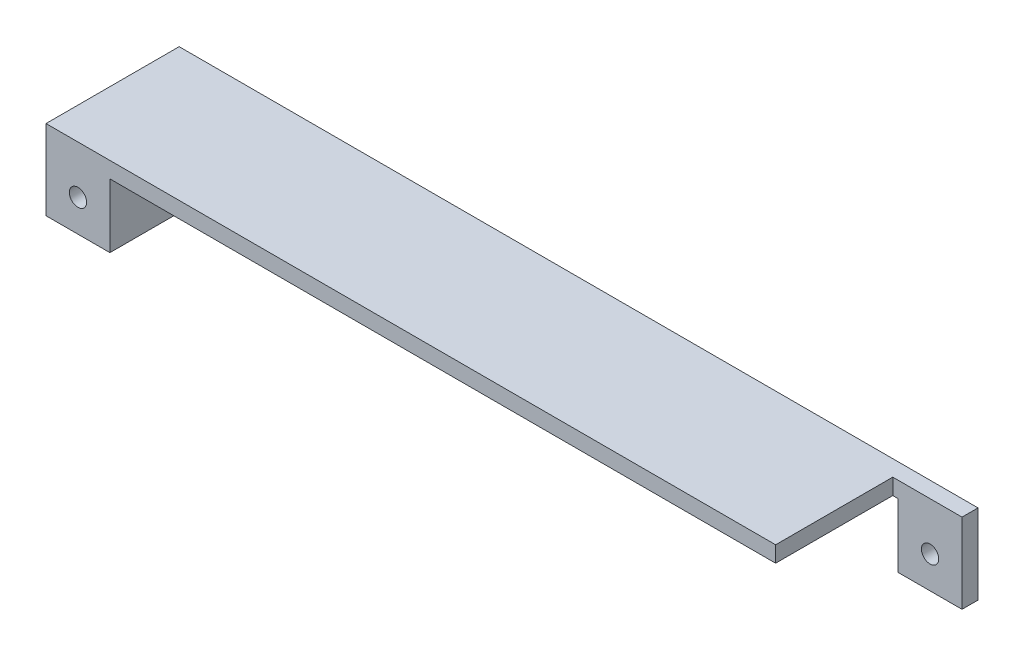
ISO-10303-21;
HEADER;
FILE_DESCRIPTION(('STEP AP214'),'2;1');
FILE_NAME('part.step','',(''),(''),'','','');
FILE_SCHEMA(('AUTOMOTIVE_DESIGN { 1 0 10303 214 1 1 1 1 }'));
ENDSEC;
DATA;
#1=APPLICATION_CONTEXT('core data for automotive mechanical design processes');
#2=APPLICATION_PROTOCOL_DEFINITION('international standard','automotive_design',2000,#1);
#3=PRODUCT_CONTEXT('',#1,'mechanical');
#4=PRODUCT('Part','Part','',(#3));
#5=PRODUCT_RELATED_PRODUCT_CATEGORY('part','',(#4));
#6=PRODUCT_DEFINITION_FORMATION('','',#4);
#7=PRODUCT_DEFINITION_CONTEXT('part definition',#1,'design');
#8=PRODUCT_DEFINITION('design','',#6,#7);
#9=PRODUCT_DEFINITION_SHAPE('','',#8);
#10=(LENGTH_UNIT() NAMED_UNIT(*) SI_UNIT(.MILLI.,.METRE.));
#11=(NAMED_UNIT(*) PLANE_ANGLE_UNIT() SI_UNIT($,.RADIAN.));
#12=(NAMED_UNIT(*) SI_UNIT($,.STERADIAN.) SOLID_ANGLE_UNIT());
#13=UNCERTAINTY_MEASURE_WITH_UNIT(LENGTH_MEASURE(1.E-05),#10,'distance_accuracy_value','');
#14=(GEOMETRIC_REPRESENTATION_CONTEXT(3) GLOBAL_UNCERTAINTY_ASSIGNED_CONTEXT((#13)) GLOBAL_UNIT_ASSIGNED_CONTEXT((#10,
#11,#12)) REPRESENTATION_CONTEXT('',''));
#15=CARTESIAN_POINT('',(0.,0.,0.));
#16=DIRECTION('',(0.,0.,1.));
#17=DIRECTION('',(1.,0.,0.));
#18=AXIS2_PLACEMENT_3D('',#15,#16,#17);
#19=CARTESIAN_POINT('',(0.,0.,0.));
#20=DIRECTION('',(0.,-1.,0.));
#21=DIRECTION('',(0.,0.,-1.));
#22=AXIS2_PLACEMENT_3D('',#19,#20,#21);
#23=PLANE('',#22);
#24=DIRECTION('',(0.,0.,-1.));
#25=VECTOR('',#24,1.);
#26=CARTESIAN_POINT('',(137.,0.,0.));
#27=LINE('',#26,#25);
#28=CARTESIAN_POINT('',(137.,0.,0.));
#29=VERTEX_POINT('',#28);
#30=CARTESIAN_POINT('',(137.,0.,-22.));
#31=VERTEX_POINT('',#30);
#32=EDGE_CURVE('E236',#29,#31,#27,.T.);
#33=ORIENTED_EDGE('',*,*,#32,.F.);
#34=DIRECTION('',(1.,0.,0.));
#35=VECTOR('',#34,1.);
#36=CARTESIAN_POINT('',(0.,0.,0.));
#37=LINE('',#36,#35);
#38=CARTESIAN_POINT('',(12.,0.,0.));
#39=VERTEX_POINT('',#38);
#40=EDGE_CURVE('E184',#39,#29,#37,.T.);
#41=ORIENTED_EDGE('',*,*,#40,.F.);
#42=DIRECTION('',(0.,0.,1.));
#43=VECTOR('',#42,1.);
#44=CARTESIAN_POINT('',(12.,0.,0.));
#45=LINE('',#44,#43);
#46=CARTESIAN_POINT('',(12.,0.,-25.));
#47=VERTEX_POINT('',#46);
#48=EDGE_CURVE('E158',#47,#39,#45,.T.);
#49=ORIENTED_EDGE('',*,*,#48,.F.);
#50=DIRECTION('',(-1.,0.,0.));
#51=VECTOR('',#50,1.);
#52=CARTESIAN_POINT('',(0.,0.,-25.));
#53=LINE('',#52,#51);
#54=CARTESIAN_POINT('',(138.,0.,-25.));
#55=VERTEX_POINT('',#54);
#56=EDGE_CURVE('E190',#55,#47,#53,.T.);
#57=ORIENTED_EDGE('',*,*,#56,.F.);
#58=DIRECTION('',(0.,0.,-1.));
#59=VECTOR('',#58,1.);
#60=CARTESIAN_POINT('',(138.,0.,0.));
#61=LINE('',#60,#59);
#62=CARTESIAN_POINT('',(138.,0.,-22.));
#63=VERTEX_POINT('',#62);
#64=EDGE_CURVE('E62',#63,#55,#61,.T.);
#65=ORIENTED_EDGE('',*,*,#64,.F.);
#66=DIRECTION('',(1.,0.,0.));
#67=VECTOR('',#66,1.);
#68=CARTESIAN_POINT('',(0.,0.,-22.));
#69=LINE('',#68,#67);
#70=EDGE_CURVE('E233',#31,#63,#69,.T.);
#71=ORIENTED_EDGE('',*,*,#70,.F.);
#72=EDGE_LOOP('',(#33,#41,#49,#57,#65,#71));
#73=FACE_BOUND('',#72,.T.);
#74=ADVANCED_FACE('F38',(#73),#23,.T.);
#75=CARTESIAN_POINT('',(0.,3.,0.));
#76=DIRECTION('',(1.,0.,0.));
#77=DIRECTION('',(0.,0.,-1.));
#78=AXIS2_PLACEMENT_3D('',#75,#76,#77);
#79=PLANE('',#78);
#80=DIRECTION('',(0.,-1.,0.));
#81=VECTOR('',#80,1.);
#82=CARTESIAN_POINT('',(0.,3.,-25.));
#83=LINE('',#82,#81);
#84=CARTESIAN_POINT('',(0.,3.,-25.));
#85=VERTEX_POINT('',#84);
#86=CARTESIAN_POINT('',(0.,-12.,-25.));
#87=VERTEX_POINT('',#86);
#88=EDGE_CURVE('E199',#85,#87,#83,.T.);
#89=ORIENTED_EDGE('',*,*,#88,.T.);
#90=DIRECTION('',(0.,0.,-1.));
#91=VECTOR('',#90,1.);
#92=CARTESIAN_POINT('',(0.,-12.,0.));
#93=LINE('',#92,#91);
#94=CARTESIAN_POINT('',(0.,-12.,0.));
#95=VERTEX_POINT('',#94);
#96=EDGE_CURVE('E159',#95,#87,#93,.T.);
#97=ORIENTED_EDGE('',*,*,#96,.F.);
#98=DIRECTION('',(0.,-1.,0.));
#99=VECTOR('',#98,1.);
#100=CARTESIAN_POINT('',(0.,3.,0.));
#101=LINE('',#100,#99);
#102=CARTESIAN_POINT('',(0.,3.,0.));
#103=VERTEX_POINT('',#102);
#104=EDGE_CURVE('E11',#103,#95,#101,.T.);
#105=ORIENTED_EDGE('',*,*,#104,.F.);
#106=DIRECTION('',(0.,0.,1.));
#107=VECTOR('',#106,1.);
#108=CARTESIAN_POINT('',(0.,3.,0.));
#109=LINE('',#108,#107);
#110=EDGE_CURVE('E185',#85,#103,#109,.T.);
#111=ORIENTED_EDGE('',*,*,#110,.F.);
#112=EDGE_LOOP('',(#89,#97,#105,#111));
#113=FACE_BOUND('',#112,.T.);
#114=ADVANCED_FACE('F40',(#113),#79,.F.);
#115=CARTESIAN_POINT('',(0.,3.,0.));
#116=DIRECTION('',(0.,0.,-1.));
#117=DIRECTION('',(-1.,0.,0.));
#118=AXIS2_PLACEMENT_3D('',#115,#116,#117);
#119=PLANE('',#118);
#120=CARTESIAN_POINT('',(6.,-6.,0.));
#121=DIRECTION('',(0.,0.,1.));
#122=DIRECTION('',(1.,0.,0.));
#123=AXIS2_PLACEMENT_3D('',#120,#121,#122);
#124=CIRCLE('',#123,1.625);
#125=CARTESIAN_POINT('',(7.625,-6.,0.));
#126=VERTEX_POINT('',#125);
#127=EDGE_CURVE('E241',#126,#126,#124,.T.);
#128=ORIENTED_EDGE('',*,*,#127,.F.);
#129=EDGE_LOOP('',(#128));
#130=FACE_BOUND('',#129,.T.);
#131=ORIENTED_EDGE('',*,*,#40,.T.);
#132=DIRECTION('',(0.,1.,0.));
#133=VECTOR('',#132,1.);
#134=CARTESIAN_POINT('',(137.,-12.,0.));
#135=LINE('',#134,#133);
#136=CARTESIAN_POINT('',(137.,3.,0.));
#137=VERTEX_POINT('',#136);
#138=EDGE_CURVE('E225',#29,#137,#135,.T.);
#139=ORIENTED_EDGE('',*,*,#138,.T.);
#140=DIRECTION('',(1.,0.,0.));
#141=VECTOR('',#140,1.);
#142=CARTESIAN_POINT('',(0.,3.,0.));
#143=LINE('',#142,#141);
#144=EDGE_CURVE('E189',#103,#137,#143,.T.);
#145=ORIENTED_EDGE('',*,*,#144,.F.);
#146=ORIENTED_EDGE('',*,*,#104,.T.);
#147=DIRECTION('',(-1.,0.,0.));
#148=VECTOR('',#147,1.);
#149=CARTESIAN_POINT('',(0.,-12.,0.));
#150=LINE('',#149,#148);
#151=CARTESIAN_POINT('',(12.,-12.,0.));
#152=VERTEX_POINT('',#151);
#153=EDGE_CURVE('E169',#152,#95,#150,.T.);
#154=ORIENTED_EDGE('',*,*,#153,.F.);
#155=DIRECTION('',(0.,1.,0.));
#156=VECTOR('',#155,1.);
#157=CARTESIAN_POINT('',(12.,-12.,0.));
#158=LINE('',#157,#156);
#159=EDGE_CURVE('E173',#152,#39,#158,.T.);
#160=ORIENTED_EDGE('',*,*,#159,.T.);
#161=EDGE_LOOP('',(#131,#139,#145,#146,#154,#160));
#162=FACE_BOUND('',#161,.T.);
#163=ADVANCED_FACE('F274',(#130,#162),#119,.F.);
#164=CARTESIAN_POINT('',(150.,3.,0.));
#165=DIRECTION('',(-1.,0.,0.));
#166=DIRECTION('',(0.,0.,1.));
#167=AXIS2_PLACEMENT_3D('',#164,#165,#166);
#168=PLANE('',#167);
#169=DIRECTION('',(0.,0.,-1.));
#170=VECTOR('',#169,1.);
#171=CARTESIAN_POINT('',(150.,3.,0.));
#172=LINE('',#171,#170);
#173=CARTESIAN_POINT('',(150.,3.,-22.));
#174=VERTEX_POINT('',#173);
#175=CARTESIAN_POINT('',(150.,3.,-25.));
#176=VERTEX_POINT('',#175);
#177=EDGE_CURVE('E133',#174,#176,#172,.T.);
#178=ORIENTED_EDGE('',*,*,#177,.F.);
#179=DIRECTION('',(0.,1.,0.));
#180=VECTOR('',#179,1.);
#181=CARTESIAN_POINT('',(150.,-12.,-22.));
#182=LINE('',#181,#180);
#183=CARTESIAN_POINT('',(150.,-12.,-22.));
#184=VERTEX_POINT('',#183);
#185=EDGE_CURVE('E119',#184,#174,#182,.T.);
#186=ORIENTED_EDGE('',*,*,#185,.F.);
#187=DIRECTION('',(0.,0.,1.));
#188=VECTOR('',#187,1.);
#189=CARTESIAN_POINT('',(150.,-12.,0.));
#190=LINE('',#189,#188);
#191=CARTESIAN_POINT('',(150.,-12.,-25.));
#192=VERTEX_POINT('',#191);
#193=EDGE_CURVE('E132',#192,#184,#190,.T.);
#194=ORIENTED_EDGE('',*,*,#193,.F.);
#195=DIRECTION('',(0.,-1.,0.));
#196=VECTOR('',#195,1.);
#197=CARTESIAN_POINT('',(150.,3.,-25.));
#198=LINE('',#197,#196);
#199=EDGE_CURVE('E48',#176,#192,#198,.T.);
#200=ORIENTED_EDGE('',*,*,#199,.F.);
#201=EDGE_LOOP('',(#178,#186,#194,#200));
#202=FACE_BOUND('',#201,.T.);
#203=ADVANCED_FACE('F130',(#202),#168,.F.);
#204=CARTESIAN_POINT('',(0.,3.,-25.));
#205=DIRECTION('',(0.,0.,1.));
#206=DIRECTION('',(1.,0.,0.));
#207=AXIS2_PLACEMENT_3D('',#204,#205,#206);
#208=PLANE('',#207);
#209=CARTESIAN_POINT('',(6.,-6.,-25.));
#210=DIRECTION('',(0.,0.,1.));
#211=DIRECTION('',(1.,0.,0.));
#212=AXIS2_PLACEMENT_3D('',#209,#210,#211);
#213=CIRCLE('',#212,1.625);
#214=CARTESIAN_POINT('',(7.625,-6.,-25.));
#215=VERTEX_POINT('',#214);
#216=EDGE_CURVE('E147',#215,#215,#213,.T.);
#217=ORIENTED_EDGE('',*,*,#216,.T.);
#218=EDGE_LOOP('',(#217));
#219=FACE_BOUND('',#218,.T.);
#220=CARTESIAN_POINT('',(144.,-5.99999999999998,-25.));
#221=DIRECTION('',(0.,0.,1.));
#222=DIRECTION('',(-1.,0.,0.));
#223=AXIS2_PLACEMENT_3D('',#220,#221,#222);
#224=CIRCLE('',#223,1.62499999999998);
#225=CARTESIAN_POINT('',(142.375,-5.99999999999998,-25.));
#226=VERTEX_POINT('',#225);
#227=EDGE_CURVE('E150',#226,#226,#224,.T.);
#228=ORIENTED_EDGE('',*,*,#227,.T.);
#229=EDGE_LOOP('',(#228));
#230=FACE_BOUND('',#229,.T.);
#231=ORIENTED_EDGE('',*,*,#199,.T.);
#232=DIRECTION('',(1.,0.,0.));
#233=VECTOR('',#232,1.);
#234=CARTESIAN_POINT('',(150.,-12.,-25.));
#235=LINE('',#234,#233);
#236=CARTESIAN_POINT('',(138.,-12.,-25.));
#237=VERTEX_POINT('',#236);
#238=EDGE_CURVE('E140',#237,#192,#235,.T.);
#239=ORIENTED_EDGE('',*,*,#238,.F.);
#240=DIRECTION('',(0.,1.,0.));
#241=VECTOR('',#240,1.);
#242=CARTESIAN_POINT('',(138.,-12.,-25.));
#243=LINE('',#242,#241);
#244=EDGE_CURVE('E154',#237,#55,#243,.T.);
#245=ORIENTED_EDGE('',*,*,#244,.T.);
#246=ORIENTED_EDGE('',*,*,#56,.T.);
#247=DIRECTION('',(0.,1.,0.));
#248=VECTOR('',#247,1.);
#249=CARTESIAN_POINT('',(12.,-12.,-25.));
#250=LINE('',#249,#248);
#251=CARTESIAN_POINT('',(12.,-12.,-25.));
#252=VERTEX_POINT('',#251);
#253=EDGE_CURVE('E180',#252,#47,#250,.T.);
#254=ORIENTED_EDGE('',*,*,#253,.F.);
#255=DIRECTION('',(1.,0.,0.));
#256=VECTOR('',#255,1.);
#257=CARTESIAN_POINT('',(0.,-12.,-25.));
#258=LINE('',#257,#256);
#259=EDGE_CURVE('E163',#87,#252,#258,.T.);
#260=ORIENTED_EDGE('',*,*,#259,.F.);
#261=ORIENTED_EDGE('',*,*,#88,.F.);
#262=DIRECTION('',(-1.,0.,0.));
#263=VECTOR('',#262,1.);
#264=CARTESIAN_POINT('',(0.,3.,-25.));
#265=LINE('',#264,#263);
#266=EDGE_CURVE('E196',#176,#85,#265,.T.);
#267=ORIENTED_EDGE('',*,*,#266,.F.);
#268=EDGE_LOOP('',(#231,#239,#245,#246,#254,#260,#261,#267));
#269=FACE_BOUND('',#268,.T.);
#270=ADVANCED_FACE('F210',(#219,#230,#269),#208,.F.);
#271=CARTESIAN_POINT('',(0.,3.,0.));
#272=DIRECTION('',(0.,-1.,0.));
#273=DIRECTION('',(0.,0.,-1.));
#274=AXIS2_PLACEMENT_3D('',#271,#272,#273);
#275=PLANE('',#274);
#276=ORIENTED_EDGE('',*,*,#144,.T.);
#277=DIRECTION('',(0.,0.,1.));
#278=VECTOR('',#277,1.);
#279=CARTESIAN_POINT('',(137.,3.,0.));
#280=LINE('',#279,#278);
#281=CARTESIAN_POINT('',(137.,3.,-22.));
#282=VERTEX_POINT('',#281);
#283=EDGE_CURVE('E125',#282,#137,#280,.T.);
#284=ORIENTED_EDGE('',*,*,#283,.F.);
#285=DIRECTION('',(-1.,0.,0.));
#286=VECTOR('',#285,1.);
#287=CARTESIAN_POINT('',(150.,3.,-22.));
#288=LINE('',#287,#286);
#289=EDGE_CURVE('E218',#174,#282,#288,.T.);
#290=ORIENTED_EDGE('',*,*,#289,.F.);
#291=ORIENTED_EDGE('',*,*,#177,.T.);
#292=ORIENTED_EDGE('',*,*,#266,.T.);
#293=ORIENTED_EDGE('',*,*,#110,.T.);
#294=EDGE_LOOP('',(#276,#284,#290,#291,#292,#293));
#295=FACE_BOUND('',#294,.T.);
#296=ADVANCED_FACE('F215',(#295),#275,.F.);
#297=CARTESIAN_POINT('',(12.,-12.,0.));
#298=DIRECTION('',(-1.,0.,0.));
#299=DIRECTION('',(0.,0.,1.));
#300=AXIS2_PLACEMENT_3D('',#297,#298,#299);
#301=PLANE('',#300);
#302=ORIENTED_EDGE('',*,*,#48,.T.);
#303=ORIENTED_EDGE('',*,*,#159,.F.);
#304=DIRECTION('',(0.,0.,1.));
#305=VECTOR('',#304,1.);
#306=CARTESIAN_POINT('',(12.,-12.,0.));
#307=LINE('',#306,#305);
#308=EDGE_CURVE('E166',#252,#152,#307,.T.);
#309=ORIENTED_EDGE('',*,*,#308,.F.);
#310=ORIENTED_EDGE('',*,*,#253,.T.);
#311=EDGE_LOOP('',(#302,#303,#309,#310));
#312=FACE_BOUND('',#311,.T.);
#313=ADVANCED_FACE('F294',(#312),#301,.F.);
#314=CARTESIAN_POINT('',(0.,-12.,0.));
#315=DIRECTION('',(0.,-1.,0.));
#316=DIRECTION('',(0.,0.,-1.));
#317=AXIS2_PLACEMENT_3D('',#314,#315,#316);
#318=PLANE('',#317);
#319=ORIENTED_EDGE('',*,*,#96,.T.);
#320=ORIENTED_EDGE('',*,*,#259,.T.);
#321=ORIENTED_EDGE('',*,*,#308,.T.);
#322=ORIENTED_EDGE('',*,*,#153,.T.);
#323=EDGE_LOOP('',(#319,#320,#321,#322));
#324=FACE_BOUND('',#323,.T.);
#325=ADVANCED_FACE('F298',(#324),#318,.T.);
#326=CARTESIAN_POINT('',(138.,-12.,0.));
#327=DIRECTION('',(1.,0.,0.));
#328=DIRECTION('',(0.,0.,-1.));
#329=AXIS2_PLACEMENT_3D('',#326,#327,#328);
#330=PLANE('',#329);
#331=DIRECTION('',(0.,0.,-1.));
#332=VECTOR('',#331,1.);
#333=CARTESIAN_POINT('',(138.,-12.,0.));
#334=LINE('',#333,#332);
#335=CARTESIAN_POINT('',(138.,-12.,-22.));
#336=VERTEX_POINT('',#335);
#337=EDGE_CURVE('E142',#336,#237,#334,.T.);
#338=ORIENTED_EDGE('',*,*,#337,.F.);
#339=DIRECTION('',(0.,1.,0.));
#340=VECTOR('',#339,1.);
#341=CARTESIAN_POINT('',(138.,-12.,-22.));
#342=LINE('',#341,#340);
#343=EDGE_CURVE('E55',#336,#63,#342,.T.);
#344=ORIENTED_EDGE('',*,*,#343,.T.);
#345=ORIENTED_EDGE('',*,*,#64,.T.);
#346=ORIENTED_EDGE('',*,*,#244,.F.);
#347=EDGE_LOOP('',(#338,#344,#345,#346));
#348=FACE_BOUND('',#347,.T.);
#349=ADVANCED_FACE('F263',(#348),#330,.F.);
#350=CARTESIAN_POINT('',(0.,-12.,0.));
#351=DIRECTION('',(0.,1.,0.));
#352=DIRECTION('',(0.,0.,1.));
#353=AXIS2_PLACEMENT_3D('',#350,#351,#352);
#354=PLANE('',#353);
#355=ORIENTED_EDGE('',*,*,#193,.T.);
#356=DIRECTION('',(-1.,0.,0.));
#357=VECTOR('',#356,1.);
#358=CARTESIAN_POINT('',(150.,-12.,-22.));
#359=LINE('',#358,#357);
#360=EDGE_CURVE('E114',#184,#336,#359,.T.);
#361=ORIENTED_EDGE('',*,*,#360,.T.);
#362=ORIENTED_EDGE('',*,*,#337,.T.);
#363=ORIENTED_EDGE('',*,*,#238,.T.);
#364=EDGE_LOOP('',(#355,#361,#362,#363));
#365=FACE_BOUND('',#364,.T.);
#366=ADVANCED_FACE('F138',(#365),#354,.F.);
#367=CARTESIAN_POINT('',(144.,-5.99999999999998,-25.));
#368=DIRECTION('',(0.,0.,1.));
#369=DIRECTION('',(1.,0.,0.));
#370=AXIS2_PLACEMENT_3D('',#367,#368,#369);
#371=CYLINDRICAL_SURFACE('',#370,1.62499999999998);
#372=CARTESIAN_POINT('',(144.,-5.99999999999998,-22.));
#373=DIRECTION('',(0.,0.,-1.));
#374=DIRECTION('',(-1.,0.,0.));
#375=AXIS2_PLACEMENT_3D('',#372,#373,#374);
#376=CIRCLE('',#375,1.62499999999998);
#377=CARTESIAN_POINT('',(142.375,-5.99999999999998,-22.));
#378=VERTEX_POINT('',#377);
#379=EDGE_CURVE('E42',#378,#378,#376,.F.);
#380=ORIENTED_EDGE('',*,*,#379,.T.);
#381=EDGE_LOOP('',(#380));
#382=FACE_BOUND('',#381,.T.);
#383=ORIENTED_EDGE('',*,*,#227,.F.);
#384=EDGE_LOOP('',(#383));
#385=FACE_BOUND('',#384,.T.);
#386=ADVANCED_FACE('F251',(#382,#385),#371,.F.);
#387=CARTESIAN_POINT('',(6.,-6.,-25.));
#388=DIRECTION('',(0.,0.,1.));
#389=DIRECTION('',(1.,0.,0.));
#390=AXIS2_PLACEMENT_3D('',#387,#388,#389);
#391=CYLINDRICAL_SURFACE('',#390,1.625);
#392=ORIENTED_EDGE('',*,*,#216,.F.);
#393=EDGE_LOOP('',(#392));
#394=FACE_BOUND('',#393,.T.);
#395=ORIENTED_EDGE('',*,*,#127,.T.);
#396=EDGE_LOOP('',(#395));
#397=FACE_BOUND('',#396,.T.);
#398=ADVANCED_FACE('F253',(#394,#397),#391,.F.);
#399=CARTESIAN_POINT('',(150.,-12.,-22.));
#400=DIRECTION('',(0.,0.,-1.));
#401=DIRECTION('',(-1.,0.,0.));
#402=AXIS2_PLACEMENT_3D('',#399,#400,#401);
#403=PLANE('',#402);
#404=ORIENTED_EDGE('',*,*,#70,.T.);
#405=ORIENTED_EDGE('',*,*,#343,.F.);
#406=ORIENTED_EDGE('',*,*,#360,.F.);
#407=ORIENTED_EDGE('',*,*,#185,.T.);
#408=ORIENTED_EDGE('',*,*,#289,.T.);
#409=DIRECTION('',(0.,1.,0.));
#410=VECTOR('',#409,1.);
#411=CARTESIAN_POINT('',(137.,-12.,-22.));
#412=LINE('',#411,#410);
#413=EDGE_CURVE('E135',#31,#282,#412,.T.);
#414=ORIENTED_EDGE('',*,*,#413,.F.);
#415=EDGE_LOOP('',(#404,#405,#406,#407,#408,#414));
#416=FACE_BOUND('',#415,.T.);
#417=ORIENTED_EDGE('',*,*,#379,.F.);
#418=EDGE_LOOP('',(#417));
#419=FACE_BOUND('',#418,.T.);
#420=ADVANCED_FACE('F116',(#416,#419),#403,.F.);
#421=CARTESIAN_POINT('',(137.,-12.,0.));
#422=DIRECTION('',(-1.,0.,0.));
#423=DIRECTION('',(0.,0.,1.));
#424=AXIS2_PLACEMENT_3D('',#421,#422,#423);
#425=PLANE('',#424);
#426=ORIENTED_EDGE('',*,*,#32,.T.);
#427=ORIENTED_EDGE('',*,*,#413,.T.);
#428=ORIENTED_EDGE('',*,*,#283,.T.);
#429=ORIENTED_EDGE('',*,*,#138,.F.);
#430=EDGE_LOOP('',(#426,#427,#428,#429));
#431=FACE_BOUND('',#430,.T.);
#432=ADVANCED_FACE('F345',(#431),#425,.F.);
#433=CLOSED_SHELL('',(#74,#114,#163,#203,#270,#296,#313,#325,#349,#366,#386,#398,#420,#432));
#434=MANIFOLD_SOLID_BREP('B2',#433);
#435=ADVANCED_BREP_SHAPE_REPRESENTATION('',(#18,#434),#14);
#436=SHAPE_DEFINITION_REPRESENTATION(#9,#435);
ENDSEC;
END-ISO-10303-21;
